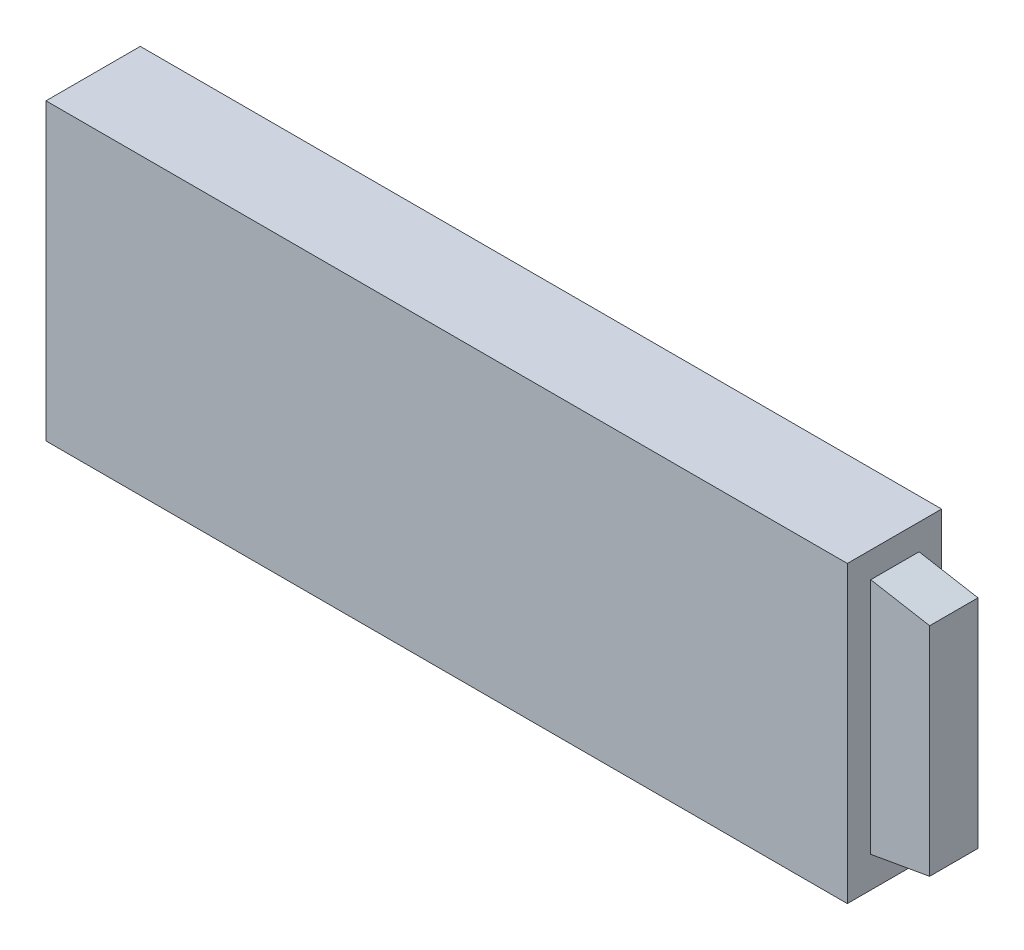
ISO-10303-21;
HEADER;
FILE_DESCRIPTION(('STEP AP214'),'2;1');
FILE_NAME('part.step','',(''),(''),'','','');
FILE_SCHEMA(('AUTOMOTIVE_DESIGN { 1 0 10303 214 1 1 1 1 }'));
ENDSEC;
DATA;
#1=APPLICATION_CONTEXT('core data for automotive mechanical design processes');
#2=APPLICATION_PROTOCOL_DEFINITION('international standard','automotive_design',2000,#1);
#3=PRODUCT_CONTEXT('',#1,'mechanical');
#4=PRODUCT('Part','Part','',(#3));
#5=PRODUCT_RELATED_PRODUCT_CATEGORY('part','',(#4));
#6=PRODUCT_DEFINITION_FORMATION('','',#4);
#7=PRODUCT_DEFINITION_CONTEXT('part definition',#1,'design');
#8=PRODUCT_DEFINITION('design','',#6,#7);
#9=PRODUCT_DEFINITION_SHAPE('','',#8);
#10=(LENGTH_UNIT() NAMED_UNIT(*) SI_UNIT(.MILLI.,.METRE.));
#11=(NAMED_UNIT(*) PLANE_ANGLE_UNIT() SI_UNIT($,.RADIAN.));
#12=(NAMED_UNIT(*) SI_UNIT($,.STERADIAN.) SOLID_ANGLE_UNIT());
#13=UNCERTAINTY_MEASURE_WITH_UNIT(LENGTH_MEASURE(1.E-05),#10,'distance_accuracy_value','');
#14=(GEOMETRIC_REPRESENTATION_CONTEXT(3) GLOBAL_UNCERTAINTY_ASSIGNED_CONTEXT((#13)) GLOBAL_UNIT_ASSIGNED_CONTEXT((#10,
#11,#12)) REPRESENTATION_CONTEXT('',''));
#15=CARTESIAN_POINT('',(0.,0.,0.));
#16=DIRECTION('',(0.,0.,1.));
#17=DIRECTION('',(1.,0.,0.));
#18=AXIS2_PLACEMENT_3D('',#15,#16,#17);
#19=CARTESIAN_POINT('',(68.,0.,-8.));
#20=DIRECTION('',(-1.,0.,0.));
#21=DIRECTION('',(0.,0.,1.));
#22=AXIS2_PLACEMENT_3D('',#19,#20,#21);
#23=PLANE('',#22);
#24=DIRECTION('',(0.,-1.,0.));
#25=VECTOR('',#24,1.);
#26=CARTESIAN_POINT('',(68.,0.,0.));
#27=LINE('',#26,#25);
#28=CARTESIAN_POINT('',(68.,0.,0.));
#29=VERTEX_POINT('',#28);
#30=CARTESIAN_POINT('',(68.,-25.,0.));
#31=VERTEX_POINT('',#30);
#32=EDGE_CURVE('E161',#29,#31,#27,.T.);
#33=ORIENTED_EDGE('',*,*,#32,.T.);
#34=DIRECTION('',(0.,0.,1.));
#35=VECTOR('',#34,1.);
#36=CARTESIAN_POINT('',(68.,-25.,-8.));
#37=LINE('',#36,#35);
#38=CARTESIAN_POINT('',(68.,-25.,-8.));
#39=VERTEX_POINT('',#38);
#40=EDGE_CURVE('E175',#39,#31,#37,.T.);
#41=ORIENTED_EDGE('',*,*,#40,.F.);
#42=DIRECTION('',(0.,-1.,0.));
#43=VECTOR('',#42,1.);
#44=CARTESIAN_POINT('',(68.,0.,-8.));
#45=LINE('',#44,#43);
#46=CARTESIAN_POINT('',(68.,0.,-8.));
#47=VERTEX_POINT('',#46);
#48=EDGE_CURVE('E146',#47,#39,#45,.T.);
#49=ORIENTED_EDGE('',*,*,#48,.F.);
#50=DIRECTION('',(0.,0.,1.));
#51=VECTOR('',#50,1.);
#52=CARTESIAN_POINT('',(68.,0.,-8.));
#53=LINE('',#52,#51);
#54=EDGE_CURVE('E171',#47,#29,#53,.T.);
#55=ORIENTED_EDGE('',*,*,#54,.T.);
#56=EDGE_LOOP('',(#33,#41,#49,#55));
#57=FACE_BOUND('',#56,.T.);
#58=DIRECTION('',(0.,-1.,0.));
#59=VECTOR('',#58,1.);
#60=CARTESIAN_POINT('',(68.,-2.18771671289868,-1.9855934080752));
#61=LINE('',#60,#59);
#62=CARTESIAN_POINT('',(68.,-2.18771671289868,-1.9855934080752));
#63=VERTEX_POINT('',#62);
#64=CARTESIAN_POINT('',(68.,-22.3687442209893,-1.9855934080752));
#65=VERTEX_POINT('',#64);
#66=EDGE_CURVE('E127',#63,#65,#61,.T.);
#67=ORIENTED_EDGE('',*,*,#66,.F.);
#68=DIRECTION('',(0.,0.,1.));
#69=VECTOR('',#68,1.);
#70=CARTESIAN_POINT('',(68.,-2.18771671289868,-1.9855934080752));
#71=LINE('',#70,#69);
#72=CARTESIAN_POINT('',(68.,-2.18771671289868,-6.08832976961011));
#73=VERTEX_POINT('',#72);
#74=EDGE_CURVE('E123',#73,#63,#71,.T.);
#75=ORIENTED_EDGE('',*,*,#74,.F.);
#76=DIRECTION('',(0.,1.,0.));
#77=VECTOR('',#76,1.);
#78=CARTESIAN_POINT('',(68.,-2.18771671289868,-6.08832976961011));
#79=LINE('',#78,#77);
#80=CARTESIAN_POINT('',(68.,-22.3687442209893,-6.08832976961011));
#81=VERTEX_POINT('',#80);
#82=EDGE_CURVE('E114',#81,#73,#79,.T.);
#83=ORIENTED_EDGE('',*,*,#82,.F.);
#84=DIRECTION('',(0.,0.,-1.));
#85=VECTOR('',#84,1.);
#86=CARTESIAN_POINT('',(68.,-22.3687442209893,-1.9855934080752));
#87=LINE('',#86,#85);
#88=EDGE_CURVE('E121',#65,#81,#87,.T.);
#89=ORIENTED_EDGE('',*,*,#88,.F.);
#90=EDGE_LOOP('',(#67,#75,#83,#89));
#91=FACE_BOUND('',#90,.T.);
#92=ADVANCED_FACE('F44',(#57,#91),#23,.F.);
#93=CARTESIAN_POINT('',(0.,0.,-8.));
#94=DIRECTION('',(-1.,0.,0.));
#95=DIRECTION('',(0.,0.,1.));
#96=AXIS2_PLACEMENT_3D('',#93,#94,#95);
#97=PLANE('',#96);
#98=DIRECTION('',(0.,-1.,0.));
#99=VECTOR('',#98,1.);
#100=CARTESIAN_POINT('',(0.,0.,0.));
#101=LINE('',#100,#99);
#102=CARTESIAN_POINT('',(0.,0.,0.));
#103=VERTEX_POINT('',#102);
#104=CARTESIAN_POINT('',(0.,-25.,0.));
#105=VERTEX_POINT('',#104);
#106=EDGE_CURVE('E153',#103,#105,#101,.T.);
#107=ORIENTED_EDGE('',*,*,#106,.F.);
#108=DIRECTION('',(0.,0.,1.));
#109=VECTOR('',#108,1.);
#110=CARTESIAN_POINT('',(0.,0.,-8.));
#111=LINE('',#110,#109);
#112=CARTESIAN_POINT('',(0.,0.,-8.));
#113=VERTEX_POINT('',#112);
#114=EDGE_CURVE('E167',#113,#103,#111,.T.);
#115=ORIENTED_EDGE('',*,*,#114,.F.);
#116=DIRECTION('',(0.,-1.,0.));
#117=VECTOR('',#116,1.);
#118=CARTESIAN_POINT('',(0.,0.,-8.));
#119=LINE('',#118,#117);
#120=CARTESIAN_POINT('',(0.,-25.,-8.));
#121=VERTEX_POINT('',#120);
#122=EDGE_CURVE('E137',#113,#121,#119,.T.);
#123=ORIENTED_EDGE('',*,*,#122,.T.);
#124=DIRECTION('',(0.,0.,1.));
#125=VECTOR('',#124,1.);
#126=CARTESIAN_POINT('',(0.,-25.,-8.));
#127=LINE('',#126,#125);
#128=EDGE_CURVE('E152',#121,#105,#127,.T.);
#129=ORIENTED_EDGE('',*,*,#128,.T.);
#130=EDGE_LOOP('',(#107,#115,#123,#129));
#131=FACE_BOUND('',#130,.T.);
#132=ADVANCED_FACE('F228',(#131),#97,.T.);
#133=CARTESIAN_POINT('',(0.,0.,-8.));
#134=DIRECTION('',(0.,-1.,0.));
#135=DIRECTION('',(0.,0.,-1.));
#136=AXIS2_PLACEMENT_3D('',#133,#134,#135);
#137=PLANE('',#136);
#138=DIRECTION('',(1.,0.,0.));
#139=VECTOR('',#138,1.);
#140=CARTESIAN_POINT('',(0.,0.,0.));
#141=LINE('',#140,#139);
#142=EDGE_CURVE('E142',#103,#29,#141,.T.);
#143=ORIENTED_EDGE('',*,*,#142,.T.);
#144=ORIENTED_EDGE('',*,*,#54,.F.);
#145=DIRECTION('',(1.,0.,0.));
#146=VECTOR('',#145,1.);
#147=CARTESIAN_POINT('',(0.,0.,-8.));
#148=LINE('',#147,#146);
#149=EDGE_CURVE('E149',#113,#47,#148,.T.);
#150=ORIENTED_EDGE('',*,*,#149,.F.);
#151=ORIENTED_EDGE('',*,*,#114,.T.);
#152=EDGE_LOOP('',(#143,#144,#150,#151));
#153=FACE_BOUND('',#152,.T.);
#154=ADVANCED_FACE('F234',(#153),#137,.F.);
#155=CARTESIAN_POINT('',(0.,-25.,-8.));
#156=DIRECTION('',(0.,-1.,0.));
#157=DIRECTION('',(0.,0.,-1.));
#158=AXIS2_PLACEMENT_3D('',#155,#156,#157);
#159=PLANE('',#158);
#160=DIRECTION('',(1.,0.,0.));
#161=VECTOR('',#160,1.);
#162=CARTESIAN_POINT('',(0.,-25.,0.));
#163=LINE('',#162,#161);
#164=EDGE_CURVE('E157',#105,#31,#163,.T.);
#165=ORIENTED_EDGE('',*,*,#164,.F.);
#166=ORIENTED_EDGE('',*,*,#128,.F.);
#167=DIRECTION('',(1.,0.,0.));
#168=VECTOR('',#167,1.);
#169=CARTESIAN_POINT('',(0.,-25.,-8.));
#170=LINE('',#169,#168);
#171=EDGE_CURVE('E141',#121,#39,#170,.T.);
#172=ORIENTED_EDGE('',*,*,#171,.T.);
#173=ORIENTED_EDGE('',*,*,#40,.T.);
#174=EDGE_LOOP('',(#165,#166,#172,#173));
#175=FACE_BOUND('',#174,.T.);
#176=ADVANCED_FACE('F239',(#175),#159,.T.);
#177=CARTESIAN_POINT('',(0.,0.,-8.));
#178=DIRECTION('',(0.,0.,1.));
#179=DIRECTION('',(1.,0.,0.));
#180=AXIS2_PLACEMENT_3D('',#177,#178,#179);
#181=PLANE('',#180);
#182=ORIENTED_EDGE('',*,*,#122,.F.);
#183=ORIENTED_EDGE('',*,*,#149,.T.);
#184=ORIENTED_EDGE('',*,*,#48,.T.);
#185=ORIENTED_EDGE('',*,*,#171,.F.);
#186=EDGE_LOOP('',(#182,#183,#184,#185));
#187=FACE_BOUND('',#186,.T.);
#188=ADVANCED_FACE('F241',(#187),#181,.F.);
#189=CARTESIAN_POINT('',(0.,0.,0.));
#190=DIRECTION('',(0.,0.,1.));
#191=DIRECTION('',(1.,0.,0.));
#192=AXIS2_PLACEMENT_3D('',#189,#190,#191);
#193=PLANE('',#192);
#194=ORIENTED_EDGE('',*,*,#106,.T.);
#195=ORIENTED_EDGE('',*,*,#164,.T.);
#196=ORIENTED_EDGE('',*,*,#32,.F.);
#197=ORIENTED_EDGE('',*,*,#142,.F.);
#198=EDGE_LOOP('',(#194,#195,#196,#197));
#199=FACE_BOUND('',#198,.T.);
#200=ADVANCED_FACE('F247',(#199),#193,.T.);
#201=CARTESIAN_POINT('',(73.,-2.18771671289868,-1.9855934080752));
#202=DIRECTION('',(0.,0.,-1.));
#203=DIRECTION('',(-1.,0.,0.));
#204=AXIS2_PLACEMENT_3D('',#201,#202,#203);
#205=PLANE('',#204);
#206=ORIENTED_EDGE('',*,*,#66,.T.);
#207=DIRECTION('',(0.984807753012209,0.173648177666928,0.));
#208=VECTOR('',#207,1.);
#209=CARTESIAN_POINT('',(73.,-21.487109317447,-1.9855934080752));
#210=LINE('',#209,#208);
#211=CARTESIAN_POINT('',(73.,-21.487109317447,-1.9855934080752));
#212=VERTEX_POINT('',#211);
#213=EDGE_CURVE('E11',#65,#212,#210,.T.);
#214=ORIENTED_EDGE('',*,*,#213,.T.);
#215=DIRECTION('',(0.,-1.,0.));
#216=VECTOR('',#215,1.);
#217=CARTESIAN_POINT('',(73.,-2.18771671289868,-1.9855934080752));
#218=LINE('',#217,#216);
#219=CARTESIAN_POINT('',(73.,-3.06935161644101,-1.9855934080752));
#220=VERTEX_POINT('',#219);
#221=EDGE_CURVE('E136',#220,#212,#218,.T.);
#222=ORIENTED_EDGE('',*,*,#221,.F.);
#223=DIRECTION('',(-0.984807753012209,0.173648177666927,0.));
#224=VECTOR('',#223,1.);
#225=CARTESIAN_POINT('',(73.,-3.06935161644101,-1.9855934080752));
#226=LINE('',#225,#224);
#227=EDGE_CURVE('E183',#220,#63,#226,.T.);
#228=ORIENTED_EDGE('',*,*,#227,.T.);
#229=EDGE_LOOP('',(#206,#214,#222,#228));
#230=FACE_BOUND('',#229,.T.);
#231=ADVANCED_FACE('F216',(#230),#205,.F.);
#232=CARTESIAN_POINT('',(73.,-2.18771671289868,-6.08832976961011));
#233=DIRECTION('',(0.,0.,1.));
#234=DIRECTION('',(0.,-1.,0.));
#235=AXIS2_PLACEMENT_3D('',#232,#233,#234);
#236=PLANE('',#235);
#237=DIRECTION('',(0.,1.,0.));
#238=VECTOR('',#237,1.);
#239=CARTESIAN_POINT('',(73.,-2.18771671289868,-6.08832976961011));
#240=LINE('',#239,#238);
#241=CARTESIAN_POINT('',(73.,-21.487109317447,-6.08832976961011));
#242=VERTEX_POINT('',#241);
#243=CARTESIAN_POINT('',(73.,-3.06935161644101,-6.08832976961011));
#244=VERTEX_POINT('',#243);
#245=EDGE_CURVE('E116',#242,#244,#240,.T.);
#246=ORIENTED_EDGE('',*,*,#245,.F.);
#247=DIRECTION('',(-0.984807753012209,-0.173648177666928,0.));
#248=VECTOR('',#247,1.);
#249=CARTESIAN_POINT('',(73.,-21.487109317447,-6.08832976961011));
#250=LINE('',#249,#248);
#251=EDGE_CURVE('E54',#242,#81,#250,.T.);
#252=ORIENTED_EDGE('',*,*,#251,.T.);
#253=ORIENTED_EDGE('',*,*,#82,.T.);
#254=DIRECTION('',(0.984807753012209,-0.173648177666927,0.));
#255=VECTOR('',#254,1.);
#256=CARTESIAN_POINT('',(73.,-3.06935161644101,-6.08832976961011));
#257=LINE('',#256,#255);
#258=EDGE_CURVE('E186',#73,#244,#257,.T.);
#259=ORIENTED_EDGE('',*,*,#258,.T.);
#260=EDGE_LOOP('',(#246,#252,#253,#259));
#261=FACE_BOUND('',#260,.T.);
#262=ADVANCED_FACE('F112',(#261),#236,.F.);
#263=CARTESIAN_POINT('',(73.,0.,0.));
#264=DIRECTION('',(1.,0.,0.));
#265=DIRECTION('',(0.,0.,-1.));
#266=AXIS2_PLACEMENT_3D('',#263,#264,#265);
#267=PLANE('',#266);
#268=ORIENTED_EDGE('',*,*,#221,.T.);
#269=DIRECTION('',(0.,0.,-1.));
#270=VECTOR('',#269,1.);
#271=CARTESIAN_POINT('',(73.,-21.487109317447,-6.08832976961011));
#272=LINE('',#271,#270);
#273=EDGE_CURVE('E118',#212,#242,#272,.T.);
#274=ORIENTED_EDGE('',*,*,#273,.T.);
#275=ORIENTED_EDGE('',*,*,#245,.T.);
#276=DIRECTION('',(0.,0.,1.));
#277=VECTOR('',#276,1.);
#278=CARTESIAN_POINT('',(73.,-3.06935161644101,-1.9855934080752));
#279=LINE('',#278,#277);
#280=EDGE_CURVE('E170',#244,#220,#279,.T.);
#281=ORIENTED_EDGE('',*,*,#280,.T.);
#282=EDGE_LOOP('',(#268,#274,#275,#281));
#283=FACE_BOUND('',#282,.T.);
#284=ADVANCED_FACE('F192',(#283),#267,.T.);
#285=CARTESIAN_POINT('',(73.,-3.06935161644101,0.));
#286=DIRECTION('',(0.173648177666927,0.984807753012209,0.));
#287=DIRECTION('',(0.,0.,-1.));
#288=AXIS2_PLACEMENT_3D('',#285,#286,#287);
#289=PLANE('',#288);
#290=ORIENTED_EDGE('',*,*,#258,.F.);
#291=ORIENTED_EDGE('',*,*,#74,.T.);
#292=ORIENTED_EDGE('',*,*,#227,.F.);
#293=ORIENTED_EDGE('',*,*,#280,.F.);
#294=EDGE_LOOP('',(#290,#291,#292,#293));
#295=FACE_BOUND('',#294,.T.);
#296=ADVANCED_FACE('F218',(#295),#289,.T.);
#297=CARTESIAN_POINT('',(73.,-21.487109317447,0.));
#298=DIRECTION('',(0.173648177666928,-0.984807753012209,0.));
#299=DIRECTION('',(0.,0.,1.));
#300=AXIS2_PLACEMENT_3D('',#297,#298,#299);
#301=PLANE('',#300);
#302=ORIENTED_EDGE('',*,*,#213,.F.);
#303=ORIENTED_EDGE('',*,*,#88,.T.);
#304=ORIENTED_EDGE('',*,*,#251,.F.);
#305=ORIENTED_EDGE('',*,*,#273,.F.);
#306=EDGE_LOOP('',(#302,#303,#304,#305));
#307=FACE_BOUND('',#306,.T.);
#308=ADVANCED_FACE('F47',(#307),#301,.T.);
#309=CLOSED_SHELL('',(#92,#132,#154,#176,#188,#200,#231,#262,#284,#296,#308));
#310=MANIFOLD_SOLID_BREP('B2',#309);
#311=ADVANCED_BREP_SHAPE_REPRESENTATION('',(#18,#310),#14);
#312=SHAPE_DEFINITION_REPRESENTATION(#9,#311);
ENDSEC;
END-ISO-10303-21;
